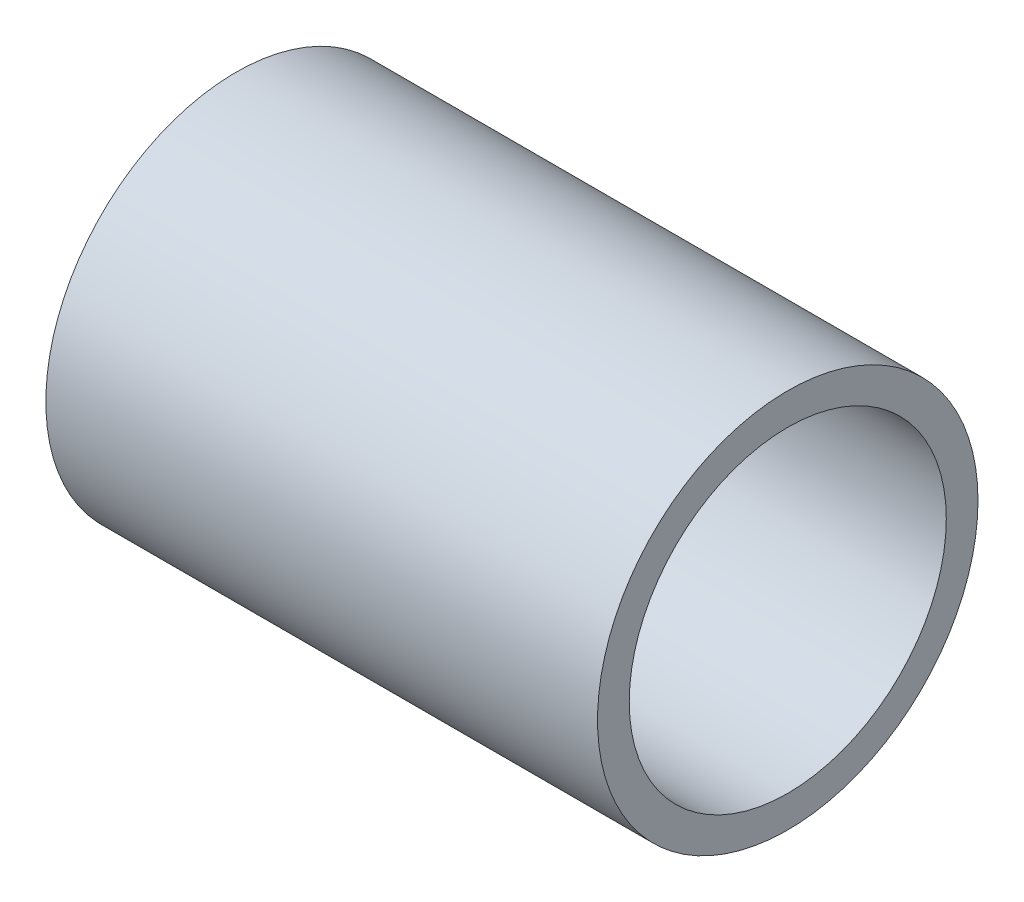
ISO-10303-21;
HEADER;
FILE_DESCRIPTION(('STEP AP214'),'2;1');
FILE_NAME('part.step','',(''),(''),'','','');
FILE_SCHEMA(('AUTOMOTIVE_DESIGN { 1 0 10303 214 1 1 1 1 }'));
ENDSEC;
DATA;
#1=APPLICATION_CONTEXT('core data for automotive mechanical design processes');
#2=APPLICATION_PROTOCOL_DEFINITION('international standard','automotive_design',2000,#1);
#3=PRODUCT_CONTEXT('',#1,'mechanical');
#4=PRODUCT('Part','Part','',(#3));
#5=PRODUCT_RELATED_PRODUCT_CATEGORY('part','',(#4));
#6=PRODUCT_DEFINITION_FORMATION('','',#4);
#7=PRODUCT_DEFINITION_CONTEXT('part definition',#1,'design');
#8=PRODUCT_DEFINITION('design','',#6,#7);
#9=PRODUCT_DEFINITION_SHAPE('','',#8);
#10=(LENGTH_UNIT() NAMED_UNIT(*) SI_UNIT(.MILLI.,.METRE.));
#11=(NAMED_UNIT(*) PLANE_ANGLE_UNIT() SI_UNIT($,.RADIAN.));
#12=(NAMED_UNIT(*) SI_UNIT($,.STERADIAN.) SOLID_ANGLE_UNIT());
#13=UNCERTAINTY_MEASURE_WITH_UNIT(LENGTH_MEASURE(1.E-05),#10,'distance_accuracy_value','');
#14=(GEOMETRIC_REPRESENTATION_CONTEXT(3) GLOBAL_UNCERTAINTY_ASSIGNED_CONTEXT((#13)) GLOBAL_UNIT_ASSIGNED_CONTEXT((#10,
#11,#12)) REPRESENTATION_CONTEXT('',''));
#15=CARTESIAN_POINT('',(0.,0.,0.));
#16=DIRECTION('',(0.,0.,1.));
#17=DIRECTION('',(1.,0.,0.));
#18=AXIS2_PLACEMENT_3D('',#15,#16,#17);
#19=CARTESIAN_POINT('',(17.4,0.,0.));
#20=DIRECTION('',(1.,0.,0.));
#21=DIRECTION('',(0.,0.,-1.));
#22=AXIS2_PLACEMENT_3D('',#19,#20,#21);
#23=PLANE('',#22);
#24=CARTESIAN_POINT('',(17.4,0.,0.));
#25=DIRECTION('',(1.,0.,0.));
#26=DIRECTION('',(0.,0.,-1.));
#27=AXIS2_PLACEMENT_3D('',#24,#25,#26);
#28=CIRCLE('',#27,6.);
#29=CARTESIAN_POINT('',(17.4,0.,-6.));
#30=VERTEX_POINT('',#29);
#31=EDGE_CURVE('E10',#30,#30,#28,.T.);
#32=ORIENTED_EDGE('',*,*,#31,.T.);
#33=EDGE_LOOP('',(#32));
#34=FACE_BOUND('',#33,.T.);
#35=CARTESIAN_POINT('',(17.4,0.,0.));
#36=DIRECTION('',(1.,0.,0.));
#37=DIRECTION('',(0.,0.,-1.));
#38=AXIS2_PLACEMENT_3D('',#35,#36,#37);
#39=CIRCLE('',#38,5.);
#40=CARTESIAN_POINT('',(17.4,0.,-5.));
#41=VERTEX_POINT('',#40);
#42=EDGE_CURVE('E54',#41,#41,#39,.T.);
#43=ORIENTED_EDGE('',*,*,#42,.F.);
#44=EDGE_LOOP('',(#43));
#45=FACE_BOUND('',#44,.T.);
#46=ADVANCED_FACE('F41',(#34,#45),#23,.T.);
#47=CARTESIAN_POINT('',(0.,0.,0.));
#48=DIRECTION('',(1.,0.,0.));
#49=DIRECTION('',(0.,0.,-1.));
#50=AXIS2_PLACEMENT_3D('',#47,#48,#49);
#51=PLANE('',#50);
#52=CARTESIAN_POINT('',(0.,0.,0.));
#53=DIRECTION('',(1.,0.,0.));
#54=DIRECTION('',(0.,0.,-1.));
#55=AXIS2_PLACEMENT_3D('',#52,#53,#54);
#56=CIRCLE('',#55,6.);
#57=CARTESIAN_POINT('',(0.,0.,-6.));
#58=VERTEX_POINT('',#57);
#59=EDGE_CURVE('E45',#58,#58,#56,.T.);
#60=ORIENTED_EDGE('',*,*,#59,.F.);
#61=EDGE_LOOP('',(#60));
#62=FACE_BOUND('',#61,.T.);
#63=CARTESIAN_POINT('',(0.,0.,0.));
#64=DIRECTION('',(1.,0.,0.));
#65=DIRECTION('',(0.,0.,-1.));
#66=AXIS2_PLACEMENT_3D('',#63,#64,#65);
#67=CIRCLE('',#66,5.);
#68=CARTESIAN_POINT('',(0.,0.,-5.));
#69=VERTEX_POINT('',#68);
#70=EDGE_CURVE('E56',#69,#69,#67,.T.);
#71=ORIENTED_EDGE('',*,*,#70,.T.);
#72=EDGE_LOOP('',(#71));
#73=FACE_BOUND('',#72,.T.);
#74=ADVANCED_FACE('F68',(#62,#73),#51,.F.);
#75=CARTESIAN_POINT('',(17.4,0.,0.));
#76=DIRECTION('',(-1.,0.,0.));
#77=DIRECTION('',(0.,0.,1.));
#78=AXIS2_PLACEMENT_3D('',#75,#76,#77);
#79=CYLINDRICAL_SURFACE('',#78,6.);
#80=ORIENTED_EDGE('',*,*,#31,.F.);
#81=EDGE_LOOP('',(#80));
#82=FACE_BOUND('',#81,.T.);
#83=ORIENTED_EDGE('',*,*,#59,.T.);
#84=EDGE_LOOP('',(#83));
#85=FACE_BOUND('',#84,.T.);
#86=ADVANCED_FACE('F43',(#82,#85),#79,.T.);
#87=CARTESIAN_POINT('',(17.4,0.,0.));
#88=DIRECTION('',(-1.,0.,0.));
#89=DIRECTION('',(0.,0.,1.));
#90=AXIS2_PLACEMENT_3D('',#87,#88,#89);
#91=CYLINDRICAL_SURFACE('',#90,5.);
#92=ORIENTED_EDGE('',*,*,#42,.T.);
#93=EDGE_LOOP('',(#92));
#94=FACE_BOUND('',#93,.T.);
#95=ORIENTED_EDGE('',*,*,#70,.F.);
#96=EDGE_LOOP('',(#95));
#97=FACE_BOUND('',#96,.T.);
#98=ADVANCED_FACE('F64',(#94,#97),#91,.F.);
#99=CLOSED_SHELL('',(#46,#74,#86,#98));
#100=MANIFOLD_SOLID_BREP('B2',#99);
#101=ADVANCED_BREP_SHAPE_REPRESENTATION('',(#18,#100),#14);
#102=SHAPE_DEFINITION_REPRESENTATION(#9,#101);
ENDSEC;
END-ISO-10303-21;
